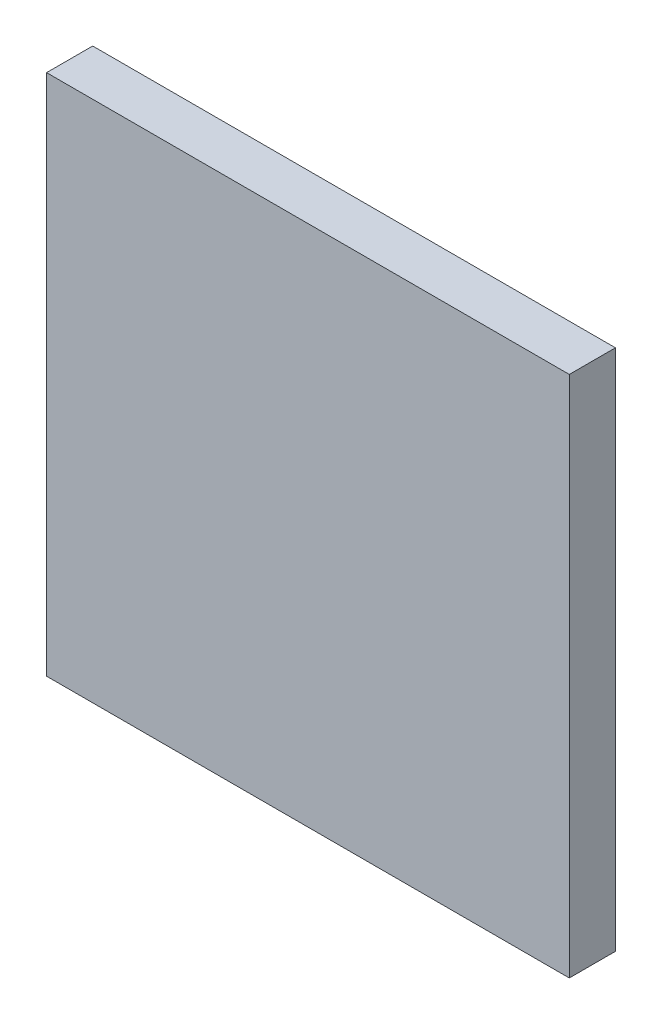
ISO-10303-21;
HEADER;
FILE_DESCRIPTION(('STEP AP214'),'2;1');
FILE_NAME('part.step','',(''),(''),'','','');
FILE_SCHEMA(('AUTOMOTIVE_DESIGN { 1 0 10303 214 1 1 1 1 }'));
ENDSEC;
DATA;
#1=APPLICATION_CONTEXT('core data for automotive mechanical design processes');
#2=APPLICATION_PROTOCOL_DEFINITION('international standard','automotive_design',2000,#1);
#3=PRODUCT_CONTEXT('',#1,'mechanical');
#4=PRODUCT('Part','Part','',(#3));
#5=PRODUCT_RELATED_PRODUCT_CATEGORY('part','',(#4));
#6=PRODUCT_DEFINITION_FORMATION('','',#4);
#7=PRODUCT_DEFINITION_CONTEXT('part definition',#1,'design');
#8=PRODUCT_DEFINITION('design','',#6,#7);
#9=PRODUCT_DEFINITION_SHAPE('','',#8);
#10=(LENGTH_UNIT() NAMED_UNIT(*) SI_UNIT(.MILLI.,.METRE.));
#11=(NAMED_UNIT(*) PLANE_ANGLE_UNIT() SI_UNIT($,.RADIAN.));
#12=(NAMED_UNIT(*) SI_UNIT($,.STERADIAN.) SOLID_ANGLE_UNIT());
#13=UNCERTAINTY_MEASURE_WITH_UNIT(LENGTH_MEASURE(1.E-05),#10,'distance_accuracy_value','');
#14=(GEOMETRIC_REPRESENTATION_CONTEXT(3) GLOBAL_UNCERTAINTY_ASSIGNED_CONTEXT((#13)) GLOBAL_UNIT_ASSIGNED_CONTEXT((#10,
#11,#12)) REPRESENTATION_CONTEXT('',''));
#15=CARTESIAN_POINT('',(0.,0.,0.));
#16=DIRECTION('',(0.,0.,1.));
#17=DIRECTION('',(1.,0.,0.));
#18=AXIS2_PLACEMENT_3D('',#15,#16,#17);
#19=CARTESIAN_POINT('',(-11.3665165268692,0.,-8.00000000000003));
#20=DIRECTION('',(0.,0.,1.));
#21=DIRECTION('',(1.,0.,0.));
#22=AXIS2_PLACEMENT_3D('',#19,#20,#21);
#23=PLANE('',#22);
#24=DIRECTION('',(0.,-1.,0.));
#25=VECTOR('',#24,1.);
#26=CARTESIAN_POINT('',(-17.,17.,-8.00000000000003));
#27=LINE('',#26,#25);
#28=CARTESIAN_POINT('',(-17.,17.,-8.00000000000003));
#29=VERTEX_POINT('',#28);
#30=CARTESIAN_POINT('',(-17.,-17.,-8.00000000000003));
#31=VERTEX_POINT('',#30);
#32=EDGE_CURVE('E92',#29,#31,#27,.T.);
#33=ORIENTED_EDGE('',*,*,#32,.T.);
#34=DIRECTION('',(1.,0.,0.));
#35=VECTOR('',#34,1.);
#36=CARTESIAN_POINT('',(-17.,-17.,-8.00000000000003));
#37=LINE('',#36,#35);
#38=CARTESIAN_POINT('',(17.,-17.,-8.00000000000003));
#39=VERTEX_POINT('',#38);
#40=EDGE_CURVE('E90',#31,#39,#37,.T.);
#41=ORIENTED_EDGE('',*,*,#40,.T.);
#42=DIRECTION('',(0.,1.,0.));
#43=VECTOR('',#42,1.);
#44=CARTESIAN_POINT('',(17.,17.,-8.00000000000003));
#45=LINE('',#44,#43);
#46=CARTESIAN_POINT('',(17.,17.,-8.00000000000003));
#47=VERTEX_POINT('',#46);
#48=EDGE_CURVE('E73',#39,#47,#45,.T.);
#49=ORIENTED_EDGE('',*,*,#48,.T.);
#50=DIRECTION('',(-1.,0.,0.));
#51=VECTOR('',#50,1.);
#52=CARTESIAN_POINT('',(-17.,17.,-8.00000000000003));
#53=LINE('',#52,#51);
#54=EDGE_CURVE('E84',#47,#29,#53,.T.);
#55=ORIENTED_EDGE('',*,*,#54,.T.);
#56=EDGE_LOOP('',(#33,#41,#49,#55));
#57=FACE_BOUND('',#56,.T.);
#58=ADVANCED_FACE('F34',(#57),#23,.T.);
#59=CARTESIAN_POINT('',(0.,0.,-11.));
#60=DIRECTION('',(0.,0.,1.));
#61=DIRECTION('',(1.,0.,0.));
#62=AXIS2_PLACEMENT_3D('',#59,#60,#61);
#63=PLANE('',#62);
#64=DIRECTION('',(0.,1.,0.));
#65=VECTOR('',#64,1.);
#66=CARTESIAN_POINT('',(17.,17.,-11.));
#67=LINE('',#66,#65);
#68=CARTESIAN_POINT('',(17.,-17.,-11.));
#69=VERTEX_POINT('',#68);
#70=CARTESIAN_POINT('',(17.,17.,-11.));
#71=VERTEX_POINT('',#70);
#72=EDGE_CURVE('E76',#69,#71,#67,.T.);
#73=ORIENTED_EDGE('',*,*,#72,.F.);
#74=DIRECTION('',(1.,0.,0.));
#75=VECTOR('',#74,1.);
#76=CARTESIAN_POINT('',(-17.,-17.,-11.));
#77=LINE('',#76,#75);
#78=CARTESIAN_POINT('',(-17.,-17.,-11.));
#79=VERTEX_POINT('',#78);
#80=EDGE_CURVE('E11',#79,#69,#77,.T.);
#81=ORIENTED_EDGE('',*,*,#80,.F.);
#82=DIRECTION('',(0.,-1.,0.));
#83=VECTOR('',#82,1.);
#84=CARTESIAN_POINT('',(-17.,17.,-11.));
#85=LINE('',#84,#83);
#86=CARTESIAN_POINT('',(-17.,17.,-11.));
#87=VERTEX_POINT('',#86);
#88=EDGE_CURVE('E96',#87,#79,#85,.T.);
#89=ORIENTED_EDGE('',*,*,#88,.F.);
#90=DIRECTION('',(-1.,0.,0.));
#91=VECTOR('',#90,1.);
#92=CARTESIAN_POINT('',(-17.,17.,-11.));
#93=LINE('',#92,#91);
#94=EDGE_CURVE('E80',#71,#87,#93,.T.);
#95=ORIENTED_EDGE('',*,*,#94,.F.);
#96=EDGE_LOOP('',(#73,#81,#89,#95));
#97=FACE_BOUND('',#96,.T.);
#98=ADVANCED_FACE('F108',(#97),#63,.F.);
#99=CARTESIAN_POINT('',(17.,17.,35.));
#100=DIRECTION('',(-1.,0.,0.));
#101=DIRECTION('',(0.,-1.,0.));
#102=AXIS2_PLACEMENT_3D('',#99,#100,#101);
#103=PLANE('',#102);
#104=ORIENTED_EDGE('',*,*,#48,.F.);
#105=DIRECTION('',(0.,0.,-1.));
#106=VECTOR('',#105,1.);
#107=CARTESIAN_POINT('',(17.,-17.,35.));
#108=LINE('',#107,#106);
#109=EDGE_CURVE('E50',#39,#69,#108,.T.);
#110=ORIENTED_EDGE('',*,*,#109,.T.);
#111=ORIENTED_EDGE('',*,*,#72,.T.);
#112=DIRECTION('',(0.,0.,-1.));
#113=VECTOR('',#112,1.);
#114=CARTESIAN_POINT('',(17.,17.,35.));
#115=LINE('',#114,#113);
#116=EDGE_CURVE('E69',#47,#71,#115,.T.);
#117=ORIENTED_EDGE('',*,*,#116,.F.);
#118=EDGE_LOOP('',(#104,#110,#111,#117));
#119=FACE_BOUND('',#118,.T.);
#120=ADVANCED_FACE('F71',(#119),#103,.F.);
#121=CARTESIAN_POINT('',(-17.,17.,35.));
#122=DIRECTION('',(0.,-1.,0.));
#123=DIRECTION('',(0.,0.,-1.));
#124=AXIS2_PLACEMENT_3D('',#121,#122,#123);
#125=PLANE('',#124);
#126=ORIENTED_EDGE('',*,*,#54,.F.);
#127=ORIENTED_EDGE('',*,*,#116,.T.);
#128=ORIENTED_EDGE('',*,*,#94,.T.);
#129=DIRECTION('',(0.,0.,-1.));
#130=VECTOR('',#129,1.);
#131=CARTESIAN_POINT('',(-17.,17.,35.));
#132=LINE('',#131,#130);
#133=EDGE_CURVE('E86',#29,#87,#132,.T.);
#134=ORIENTED_EDGE('',*,*,#133,.F.);
#135=EDGE_LOOP('',(#126,#127,#128,#134));
#136=FACE_BOUND('',#135,.T.);
#137=ADVANCED_FACE('F85',(#136),#125,.F.);
#138=CARTESIAN_POINT('',(-17.,17.,35.));
#139=DIRECTION('',(1.,0.,0.));
#140=DIRECTION('',(0.,1.,0.));
#141=AXIS2_PLACEMENT_3D('',#138,#139,#140);
#142=PLANE('',#141);
#143=ORIENTED_EDGE('',*,*,#32,.F.);
#144=ORIENTED_EDGE('',*,*,#133,.T.);
#145=ORIENTED_EDGE('',*,*,#88,.T.);
#146=DIRECTION('',(0.,0.,-1.));
#147=VECTOR('',#146,1.);
#148=CARTESIAN_POINT('',(-17.,-17.,35.));
#149=LINE('',#148,#147);
#150=EDGE_CURVE('E37',#31,#79,#149,.T.);
#151=ORIENTED_EDGE('',*,*,#150,.F.);
#152=EDGE_LOOP('',(#143,#144,#145,#151));
#153=FACE_BOUND('',#152,.T.);
#154=ADVANCED_FACE('F104',(#153),#142,.F.);
#155=CARTESIAN_POINT('',(-17.,-17.,35.));
#156=DIRECTION('',(0.,1.,0.));
#157=DIRECTION('',(0.,0.,1.));
#158=AXIS2_PLACEMENT_3D('',#155,#156,#157);
#159=PLANE('',#158);
#160=ORIENTED_EDGE('',*,*,#40,.F.);
#161=ORIENTED_EDGE('',*,*,#150,.T.);
#162=ORIENTED_EDGE('',*,*,#80,.T.);
#163=ORIENTED_EDGE('',*,*,#109,.F.);
#164=EDGE_LOOP('',(#160,#161,#162,#163));
#165=FACE_BOUND('',#164,.T.);
#166=ADVANCED_FACE('F106',(#165),#159,.F.);
#167=CLOSED_SHELL('',(#58,#98,#120,#137,#154,#166));
#168=MANIFOLD_SOLID_BREP('B2',#167);
#169=ADVANCED_BREP_SHAPE_REPRESENTATION('',(#18,#168),#14);
#170=SHAPE_DEFINITION_REPRESENTATION(#9,#169);
ENDSEC;
END-ISO-10303-21;
